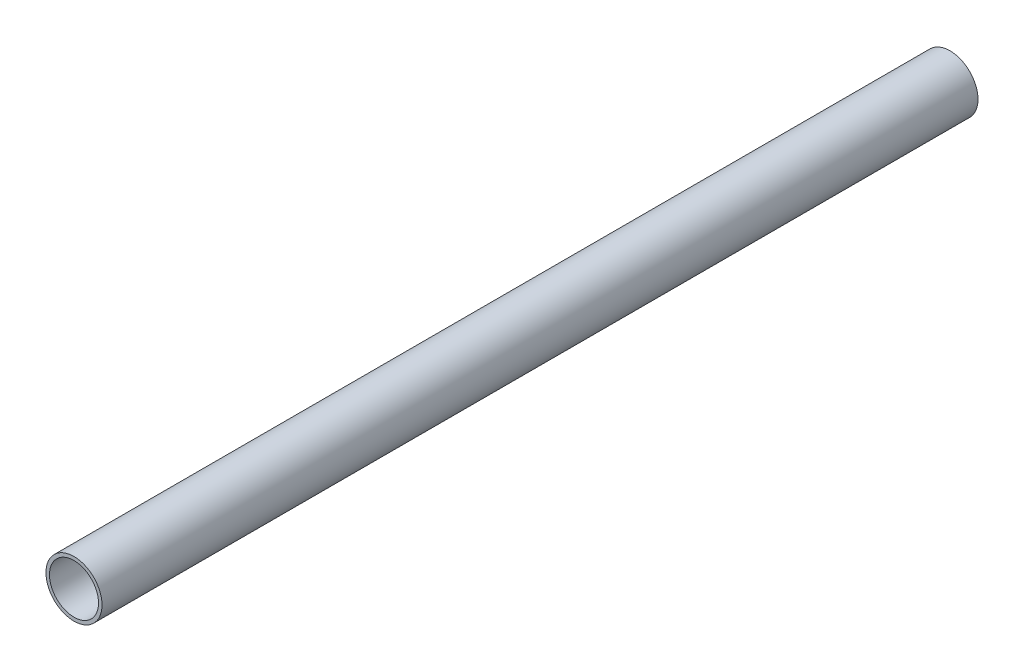
ISO-10303-21;
HEADER;
FILE_DESCRIPTION(('STEP AP214'),'2;1');
FILE_NAME('part.step','',(''),(''),'','','');
FILE_SCHEMA(('AUTOMOTIVE_DESIGN { 1 0 10303 214 1 1 1 1 }'));
ENDSEC;
DATA;
#1=APPLICATION_CONTEXT('core data for automotive mechanical design processes');
#2=APPLICATION_PROTOCOL_DEFINITION('international standard','automotive_design',2000,#1);
#3=PRODUCT_CONTEXT('',#1,'mechanical');
#4=PRODUCT('Part','Part','',(#3));
#5=PRODUCT_RELATED_PRODUCT_CATEGORY('part','',(#4));
#6=PRODUCT_DEFINITION_FORMATION('','',#4);
#7=PRODUCT_DEFINITION_CONTEXT('part definition',#1,'design');
#8=PRODUCT_DEFINITION('design','',#6,#7);
#9=PRODUCT_DEFINITION_SHAPE('','',#8);
#10=(LENGTH_UNIT() NAMED_UNIT(*) SI_UNIT(.MILLI.,.METRE.));
#11=(NAMED_UNIT(*) PLANE_ANGLE_UNIT() SI_UNIT($,.RADIAN.));
#12=(NAMED_UNIT(*) SI_UNIT($,.STERADIAN.) SOLID_ANGLE_UNIT());
#13=UNCERTAINTY_MEASURE_WITH_UNIT(LENGTH_MEASURE(1.E-05),#10,'distance_accuracy_value','');
#14=(GEOMETRIC_REPRESENTATION_CONTEXT(3) GLOBAL_UNCERTAINTY_ASSIGNED_CONTEXT((#13)) GLOBAL_UNIT_ASSIGNED_CONTEXT((#10,
#11,#12)) REPRESENTATION_CONTEXT('',''));
#15=CARTESIAN_POINT('',(0.,0.,0.));
#16=DIRECTION('',(0.,0.,1.));
#17=DIRECTION('',(1.,0.,0.));
#18=AXIS2_PLACEMENT_3D('',#15,#16,#17);
#19=CARTESIAN_POINT('',(0.,0.,250.));
#20=DIRECTION('',(0.,0.,1.));
#21=DIRECTION('',(1.,0.,0.));
#22=AXIS2_PLACEMENT_3D('',#19,#20,#21);
#23=PLANE('',#22);
#24=CARTESIAN_POINT('',(0.,0.,250.));
#25=DIRECTION('',(0.,0.,1.));
#26=DIRECTION('',(1.,0.,0.));
#27=AXIS2_PLACEMENT_3D('',#24,#25,#26);
#28=CIRCLE('',#27,8.);
#29=CARTESIAN_POINT('',(8.,0.,250.));
#30=VERTEX_POINT('',#29);
#31=EDGE_CURVE('E10',#30,#30,#28,.T.);
#32=ORIENTED_EDGE('',*,*,#31,.T.);
#33=EDGE_LOOP('',(#32));
#34=FACE_BOUND('',#33,.T.);
#35=CARTESIAN_POINT('',(0.,0.,250.));
#36=DIRECTION('',(0.,0.,1.));
#37=DIRECTION('',(1.,0.,0.));
#38=AXIS2_PLACEMENT_3D('',#35,#36,#37);
#39=CIRCLE('',#38,7.);
#40=CARTESIAN_POINT('',(7.,0.,250.));
#41=VERTEX_POINT('',#40);
#42=EDGE_CURVE('E44',#41,#41,#39,.T.);
#43=ORIENTED_EDGE('',*,*,#42,.F.);
#44=EDGE_LOOP('',(#43));
#45=FACE_BOUND('',#44,.T.);
#46=ADVANCED_FACE('F33',(#34,#45),#23,.T.);
#47=CARTESIAN_POINT('',(0.,0.,0.));
#48=DIRECTION('',(0.,0.,1.));
#49=DIRECTION('',(1.,0.,0.));
#50=AXIS2_PLACEMENT_3D('',#47,#48,#49);
#51=PLANE('',#50);
#52=CARTESIAN_POINT('',(0.,0.,0.));
#53=DIRECTION('',(0.,0.,1.));
#54=DIRECTION('',(1.,0.,0.));
#55=AXIS2_PLACEMENT_3D('',#52,#53,#54);
#56=CIRCLE('',#55,8.);
#57=CARTESIAN_POINT('',(8.,0.,0.));
#58=VERTEX_POINT('',#57);
#59=EDGE_CURVE('E37',#58,#58,#56,.T.);
#60=ORIENTED_EDGE('',*,*,#59,.F.);
#61=EDGE_LOOP('',(#60));
#62=FACE_BOUND('',#61,.T.);
#63=CARTESIAN_POINT('',(0.,0.,0.));
#64=DIRECTION('',(0.,0.,1.));
#65=DIRECTION('',(1.,0.,0.));
#66=AXIS2_PLACEMENT_3D('',#63,#64,#65);
#67=CIRCLE('',#66,7.);
#68=CARTESIAN_POINT('',(7.,0.,0.));
#69=VERTEX_POINT('',#68);
#70=EDGE_CURVE('E46',#69,#69,#67,.T.);
#71=ORIENTED_EDGE('',*,*,#70,.T.);
#72=EDGE_LOOP('',(#71));
#73=FACE_BOUND('',#72,.T.);
#74=ADVANCED_FACE('F56',(#62,#73),#51,.F.);
#75=CARTESIAN_POINT('',(0.,0.,250.));
#76=DIRECTION('',(0.,0.,-1.));
#77=DIRECTION('',(-1.,0.,0.));
#78=AXIS2_PLACEMENT_3D('',#75,#76,#77);
#79=CYLINDRICAL_SURFACE('',#78,8.);
#80=ORIENTED_EDGE('',*,*,#31,.F.);
#81=EDGE_LOOP('',(#80));
#82=FACE_BOUND('',#81,.T.);
#83=ORIENTED_EDGE('',*,*,#59,.T.);
#84=EDGE_LOOP('',(#83));
#85=FACE_BOUND('',#84,.T.);
#86=ADVANCED_FACE('F35',(#82,#85),#79,.T.);
#87=CARTESIAN_POINT('',(0.,0.,250.));
#88=DIRECTION('',(0.,0.,-1.));
#89=DIRECTION('',(-1.,0.,0.));
#90=AXIS2_PLACEMENT_3D('',#87,#88,#89);
#91=CYLINDRICAL_SURFACE('',#90,7.);
#92=ORIENTED_EDGE('',*,*,#42,.T.);
#93=EDGE_LOOP('',(#92));
#94=FACE_BOUND('',#93,.T.);
#95=ORIENTED_EDGE('',*,*,#70,.F.);
#96=EDGE_LOOP('',(#95));
#97=FACE_BOUND('',#96,.T.);
#98=ADVANCED_FACE('F52',(#94,#97),#91,.F.);
#99=CLOSED_SHELL('',(#46,#74,#86,#98));
#100=MANIFOLD_SOLID_BREP('B2',#99);
#101=ADVANCED_BREP_SHAPE_REPRESENTATION('',(#18,#100),#14);
#102=SHAPE_DEFINITION_REPRESENTATION(#9,#101);
ENDSEC;
END-ISO-10303-21;
